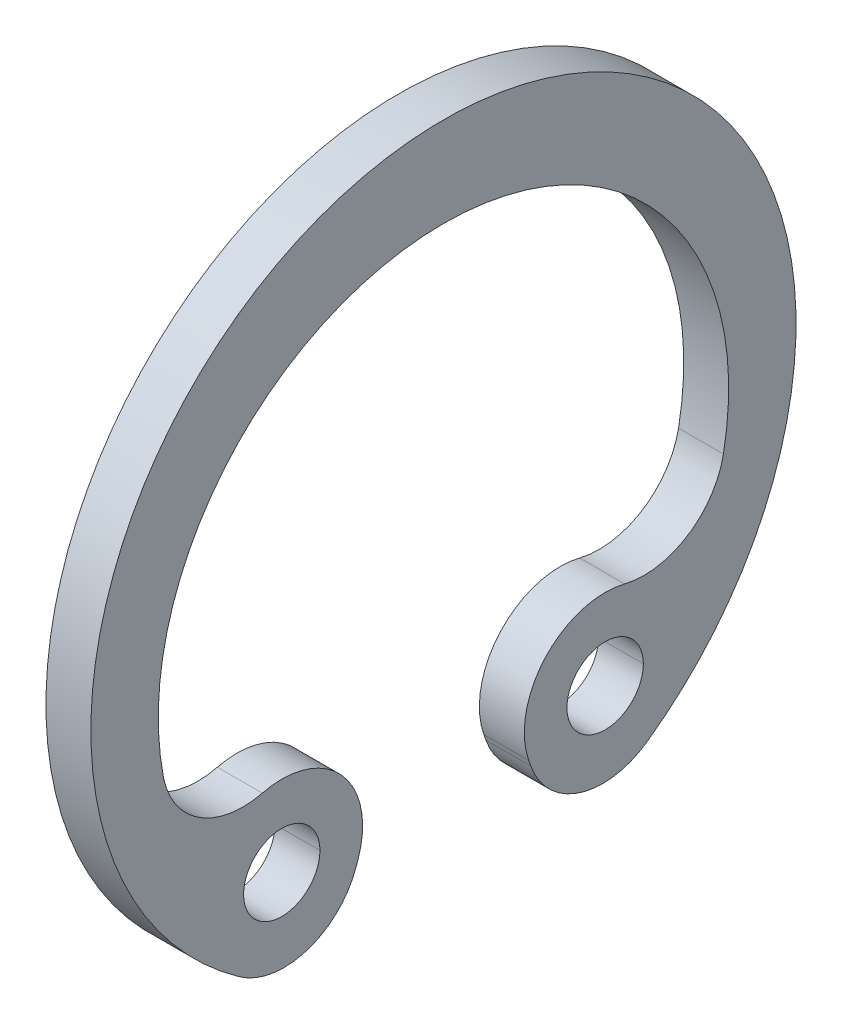
ISO-10303-21;
HEADER;
FILE_DESCRIPTION(('STEP AP214'),'2;1');
FILE_NAME('part.step','',(''),(''),'','','');
FILE_SCHEMA(('AUTOMOTIVE_DESIGN { 1 0 10303 214 1 1 1 1 }'));
ENDSEC;
DATA;
#1=APPLICATION_CONTEXT('core data for automotive mechanical design processes');
#2=APPLICATION_PROTOCOL_DEFINITION('international standard','automotive_design',2000,#1);
#3=PRODUCT_CONTEXT('',#1,'mechanical');
#4=PRODUCT('Part','Part','',(#3));
#5=PRODUCT_RELATED_PRODUCT_CATEGORY('part','',(#4));
#6=PRODUCT_DEFINITION_FORMATION('','',#4);
#7=PRODUCT_DEFINITION_CONTEXT('part definition',#1,'design');
#8=PRODUCT_DEFINITION('design','',#6,#7);
#9=PRODUCT_DEFINITION_SHAPE('','',#8);
#10=(LENGTH_UNIT() NAMED_UNIT(*) SI_UNIT(.MILLI.,.METRE.));
#11=(NAMED_UNIT(*) PLANE_ANGLE_UNIT() SI_UNIT($,.RADIAN.));
#12=(NAMED_UNIT(*) SI_UNIT($,.STERADIAN.) SOLID_ANGLE_UNIT());
#13=UNCERTAINTY_MEASURE_WITH_UNIT(LENGTH_MEASURE(1.E-05),#10,'distance_accuracy_value','');
#14=(GEOMETRIC_REPRESENTATION_CONTEXT(3) GLOBAL_UNCERTAINTY_ASSIGNED_CONTEXT((#13)) GLOBAL_UNIT_ASSIGNED_CONTEXT((#10,
#11,#12)) REPRESENTATION_CONTEXT('',''));
#15=CARTESIAN_POINT('',(0.,0.,0.));
#16=DIRECTION('',(0.,0.,1.));
#17=DIRECTION('',(1.,0.,0.));
#18=AXIS2_PLACEMENT_3D('',#15,#16,#17);
#19=CARTESIAN_POINT('',(0.5,-5.02211952987674,-3.54976272835661));
#20=DIRECTION('',(-1.,0.,0.));
#21=DIRECTION('',(0.,0.952290600530426,-0.30519274588594));
#22=AXIS2_PLACEMENT_3D('',#19,#20,#21);
#23=CYLINDRICAL_SURFACE('',#22,1.70000000000007);
#24=CARTESIAN_POINT('',(-0.5,-5.02211952987674,-3.54976272835661));
#25=DIRECTION('',(1.,0.,0.));
#26=DIRECTION('',(0.,0.,-1.));
#27=AXIS2_PLACEMENT_3D('',#24,#25,#26);
#28=CIRCLE('',#27,1.70000000000007);
#29=CARTESIAN_POINT('',(-0.5,-5.5813841739608,-1.9443895449884));
#30=VERTEX_POINT('',#29);
#31=CARTESIAN_POINT('',(-0.5,-6.4103476487508,-4.5309980161279));
#32=VERTEX_POINT('',#31);
#33=EDGE_CURVE('E11',#30,#32,#28,.T.);
#34=ORIENTED_EDGE('',*,*,#33,.T.);
#35=DIRECTION('',(-1.,0.,0.));
#36=VECTOR('',#35,1.);
#37=CARTESIAN_POINT('',(0.5,-6.4103476487508,-4.5309980161279));
#38=LINE('',#37,#36);
#39=CARTESIAN_POINT('',(0.5,-6.4103476487508,-4.5309980161279));
#40=VERTEX_POINT('',#39);
#41=EDGE_CURVE('E25',#40,#32,#38,.T.);
#42=ORIENTED_EDGE('',*,*,#41,.F.);
#43=CARTESIAN_POINT('',(0.5,-5.02211952987674,-3.54976272835661));
#44=DIRECTION('',(1.,0.,0.));
#45=DIRECTION('',(0.,0.,-1.));
#46=AXIS2_PLACEMENT_3D('',#43,#44,#45);
#47=CIRCLE('',#46,1.70000000000007);
#48=CARTESIAN_POINT('',(0.5,-5.5813841739608,-1.9443895449884));
#49=VERTEX_POINT('',#48);
#50=EDGE_CURVE('E301',#49,#40,#47,.T.);
#51=ORIENTED_EDGE('',*,*,#50,.F.);
#52=DIRECTION('',(-1.,0.,0.));
#53=VECTOR('',#52,1.);
#54=CARTESIAN_POINT('',(0.5,-5.5813841739608,-1.9443895449884));
#55=LINE('',#54,#53);
#56=EDGE_CURVE('E297',#49,#30,#55,.T.);
#57=ORIENTED_EDGE('',*,*,#56,.T.);
#58=EDGE_LOOP('',(#34,#42,#51,#57));
#59=FACE_BOUND('',#58,.T.);
#60=ADVANCED_FACE('F17',(#59),#23,.T.);
#61=CARTESIAN_POINT('',(0.5,-5.4545179606316,-1.9001930999631));
#62=DIRECTION('',(0.,0.328979202402276,-0.944337166687175));
#63=DIRECTION('',(0.,0.944337166687175,0.328979202402276));
#64=AXIS2_PLACEMENT_3D('',#61,#62,#63);
#65=PLANE('',#64);
#66=DIRECTION('',(0.,-0.944337166687175,-0.328979202402276));
#67=VECTOR('',#66,1.);
#68=CARTESIAN_POINT('',(-0.5,-5.4545179606316,-1.9001930999631));
#69=LINE('',#68,#67);
#70=CARTESIAN_POINT('',(-0.5,-5.4545179606316,-1.9001930999631));
#71=VERTEX_POINT('',#70);
#72=EDGE_CURVE('E292',#71,#30,#69,.T.);
#73=ORIENTED_EDGE('',*,*,#72,.T.);
#74=ORIENTED_EDGE('',*,*,#56,.F.);
#75=DIRECTION('',(0.,-0.944337166687175,-0.328979202402276));
#76=VECTOR('',#75,1.);
#77=CARTESIAN_POINT('',(0.5,-5.4545179606316,-1.9001930999631));
#78=LINE('',#77,#76);
#79=CARTESIAN_POINT('',(0.5,-5.4545179606316,-1.9001930999631));
#80=VERTEX_POINT('',#79);
#81=EDGE_CURVE('E287',#80,#49,#78,.T.);
#82=ORIENTED_EDGE('',*,*,#81,.F.);
#83=DIRECTION('',(-1.,0.,0.));
#84=VECTOR('',#83,1.);
#85=CARTESIAN_POINT('',(0.5,-5.4545179606316,-1.9001930999631));
#86=LINE('',#85,#84);
#87=EDGE_CURVE('E283',#80,#71,#86,.T.);
#88=ORIENTED_EDGE('',*,*,#87,.T.);
#89=EDGE_LOOP('',(#73,#74,#82,#88));
#90=FACE_BOUND('',#89,.T.);
#91=ADVANCED_FACE('F318',(#90),#65,.F.);
#92=CARTESIAN_POINT('',(0.5,-4.86235539630743,-3.6));
#93=DIRECTION('',(-1.,0.,0.));
#94=DIRECTION('',(0.,-0.673781281340793,-0.738930839060571));
#95=AXIS2_PLACEMENT_3D('',#92,#93,#94);
#96=CYLINDRICAL_SURFACE('',#95,1.8);
#97=CARTESIAN_POINT('',(-0.5,-4.86235539630743,-3.6));
#98=DIRECTION('',(1.,0.,0.));
#99=DIRECTION('',(0.,0.,-1.));
#100=AXIS2_PLACEMENT_3D('',#97,#98,#99);
#101=CIRCLE('',#100,1.8);
#102=CARTESIAN_POINT('',(-0.5,-3.1152620571958,-4.033203029112));
#103=VERTEX_POINT('',#102);
#104=EDGE_CURVE('E278',#103,#71,#101,.T.);
#105=ORIENTED_EDGE('',*,*,#104,.T.);
#106=ORIENTED_EDGE('',*,*,#87,.F.);
#107=CARTESIAN_POINT('',(0.5,-4.86235539630743,-3.6));
#108=DIRECTION('',(1.,0.,0.));
#109=DIRECTION('',(0.,0.,-1.));
#110=AXIS2_PLACEMENT_3D('',#107,#108,#109);
#111=CIRCLE('',#110,1.8);
#112=CARTESIAN_POINT('',(0.5,-3.1152620571958,-4.033203029112));
#113=VERTEX_POINT('',#112);
#114=EDGE_CURVE('E273',#113,#80,#111,.T.);
#115=ORIENTED_EDGE('',*,*,#114,.F.);
#116=DIRECTION('',(-1.,0.,0.));
#117=VECTOR('',#116,1.);
#118=CARTESIAN_POINT('',(0.5,-3.1152620571958,-4.033203029112));
#119=LINE('',#118,#117);
#120=EDGE_CURVE('E269',#113,#103,#119,.T.);
#121=ORIENTED_EDGE('',*,*,#120,.T.);
#122=EDGE_LOOP('',(#105,#106,#115,#121));
#123=FACE_BOUND('',#122,.T.);
#124=ADVANCED_FACE('F350',(#123),#96,.T.);
#125=CARTESIAN_POINT('',(0.5,-1.36816871808412,-4.46640605822394));
#126=DIRECTION('',(-1.,0.,0.));
#127=DIRECTION('',(0.,0.84304351995622,0.537845352736106));
#128=AXIS2_PLACEMENT_3D('',#125,#126,#127);
#129=CYLINDRICAL_SURFACE('',#128,1.80000000000005);
#130=CARTESIAN_POINT('',(-0.5,-1.36816871808412,-4.46640605822394));
#131=DIRECTION('',(1.,0.,0.));
#132=DIRECTION('',(0.,0.,-1.));
#133=AXIS2_PLACEMENT_3D('',#130,#131,#132);
#134=CIRCLE('',#133,1.80000000000005);
#135=CARTESIAN_POINT('',(-0.5,-1.71162007908451,-6.2333359274115));
#136=VERTEX_POINT('',#135);
#137=EDGE_CURVE('E264',#103,#136,#134,.T.);
#138=ORIENTED_EDGE('',*,*,#137,.F.);
#139=ORIENTED_EDGE('',*,*,#120,.F.);
#140=CARTESIAN_POINT('',(0.5,-1.36816871808412,-4.46640605822394));
#141=DIRECTION('',(1.,0.,0.));
#142=DIRECTION('',(0.,0.,-1.));
#143=AXIS2_PLACEMENT_3D('',#140,#141,#142);
#144=CIRCLE('',#143,1.80000000000005);
#145=CARTESIAN_POINT('',(0.5,-1.71162007908451,-6.2333359274115));
#146=VERTEX_POINT('',#145);
#147=EDGE_CURVE('E260',#113,#146,#144,.T.);
#148=ORIENTED_EDGE('',*,*,#147,.T.);
#149=DIRECTION('',(-1.,0.,0.));
#150=VECTOR('',#149,1.);
#151=CARTESIAN_POINT('',(0.5,-1.71162007908451,-6.2333359274115));
#152=LINE('',#151,#150);
#153=EDGE_CURVE('E256',#146,#136,#152,.T.);
#154=ORIENTED_EDGE('',*,*,#153,.T.);
#155=EDGE_LOOP('',(#138,#139,#148,#154));
#156=FACE_BOUND('',#155,.T.);
#157=ADVANCED_FACE('F347',(#156),#129,.F.);
#158=CARTESIAN_POINT('',(0.5,-0.499999999999989,0.));
#159=DIRECTION('',(-1.,0.,0.));
#160=DIRECTION('',(0.,-1.,3.31866429354254E-09));
#161=AXIS2_PLACEMENT_3D('',#158,#159,#160);
#162=CYLINDRICAL_SURFACE('',#161,6.35);
#163=CARTESIAN_POINT('',(-0.5,-0.499999999999989,0.));
#164=DIRECTION('',(1.,0.,0.));
#165=DIRECTION('',(0.,0.,-1.));
#166=AXIS2_PLACEMENT_3D('',#163,#164,#165);
#167=CIRCLE('',#166,6.35);
#168=CARTESIAN_POINT('',(-0.5,-1.711620037712,6.2333359354534));
#169=VERTEX_POINT('',#168);
#170=EDGE_CURVE('E251',#136,#169,#167,.T.);
#171=ORIENTED_EDGE('',*,*,#170,.F.);
#172=ORIENTED_EDGE('',*,*,#153,.F.);
#173=CARTESIAN_POINT('',(0.5,-0.499999999999989,0.));
#174=DIRECTION('',(1.,0.,0.));
#175=DIRECTION('',(0.,0.,-1.));
#176=AXIS2_PLACEMENT_3D('',#173,#174,#175);
#177=CIRCLE('',#176,6.35);
#178=CARTESIAN_POINT('',(0.5,-1.711620037712,6.2333359354534));
#179=VERTEX_POINT('',#178);
#180=EDGE_CURVE('E247',#146,#179,#177,.T.);
#181=ORIENTED_EDGE('',*,*,#180,.T.);
#182=DIRECTION('',(-1.,0.,0.));
#183=VECTOR('',#182,1.);
#184=CARTESIAN_POINT('',(0.5,-1.711620037712,6.2333359354534));
#185=LINE('',#184,#183);
#186=EDGE_CURVE('E243',#179,#169,#185,.T.);
#187=ORIENTED_EDGE('',*,*,#186,.T.);
#188=EDGE_LOOP('',(#171,#172,#181,#187));
#189=FACE_BOUND('',#188,.T.);
#190=ADVANCED_FACE('F344',(#189),#162,.F.);
#191=CARTESIAN_POINT('',(0.5,-1.36816871808408,4.46640605822394));
#192=DIRECTION('',(-1.,0.,0.));
#193=DIRECTION('',(0.,0.843043513659422,-0.537845362605996));
#194=AXIS2_PLACEMENT_3D('',#191,#192,#193);
#195=CYLINDRICAL_SURFACE('',#194,1.80000000000008);
#196=CARTESIAN_POINT('',(-0.5,-1.36816871808408,4.46640605822394));
#197=DIRECTION('',(1.,0.,0.));
#198=DIRECTION('',(0.,0.,-1.));
#199=AXIS2_PLACEMENT_3D('',#196,#197,#198);
#200=CIRCLE('',#199,1.80000000000008);
#201=CARTESIAN_POINT('',(-0.5,-3.1152620571958,4.033203029112));
#202=VERTEX_POINT('',#201);
#203=EDGE_CURVE('E238',#169,#202,#200,.T.);
#204=ORIENTED_EDGE('',*,*,#203,.F.);
#205=ORIENTED_EDGE('',*,*,#186,.F.);
#206=CARTESIAN_POINT('',(0.5,-1.36816871808408,4.46640605822394));
#207=DIRECTION('',(1.,0.,0.));
#208=DIRECTION('',(0.,0.,-1.));
#209=AXIS2_PLACEMENT_3D('',#206,#207,#208);
#210=CIRCLE('',#209,1.80000000000008);
#211=CARTESIAN_POINT('',(0.5,-3.1152620571958,4.033203029112));
#212=VERTEX_POINT('',#211);
#213=EDGE_CURVE('E234',#179,#212,#210,.T.);
#214=ORIENTED_EDGE('',*,*,#213,.T.);
#215=DIRECTION('',(-1.,0.,0.));
#216=VECTOR('',#215,1.);
#217=CARTESIAN_POINT('',(0.5,-3.1152620571958,4.033203029112));
#218=LINE('',#217,#216);
#219=EDGE_CURVE('E230',#212,#202,#218,.T.);
#220=ORIENTED_EDGE('',*,*,#219,.T.);
#221=EDGE_LOOP('',(#204,#205,#214,#220));
#222=FACE_BOUND('',#221,.T.);
#223=ADVANCED_FACE('F337',(#222),#195,.F.);
#224=CARTESIAN_POINT('',(0.5,-4.86235539630743,3.6));
#225=DIRECTION('',(-1.,0.,0.));
#226=DIRECTION('',(0.,-0.673781281340793,0.738930839060571));
#227=AXIS2_PLACEMENT_3D('',#224,#225,#226);
#228=CYLINDRICAL_SURFACE('',#227,1.8);
#229=CARTESIAN_POINT('',(-0.5,-4.86235539630743,3.6));
#230=DIRECTION('',(1.,0.,0.));
#231=DIRECTION('',(0.,0.,-1.));
#232=AXIS2_PLACEMENT_3D('',#229,#230,#231);
#233=CIRCLE('',#232,1.8);
#234=CARTESIAN_POINT('',(-0.5,-5.4545179606316,1.9001930999631));
#235=VERTEX_POINT('',#234);
#236=EDGE_CURVE('E225',#235,#202,#233,.T.);
#237=ORIENTED_EDGE('',*,*,#236,.T.);
#238=ORIENTED_EDGE('',*,*,#219,.F.);
#239=CARTESIAN_POINT('',(0.5,-4.86235539630743,3.6));
#240=DIRECTION('',(1.,0.,0.));
#241=DIRECTION('',(0.,0.,-1.));
#242=AXIS2_PLACEMENT_3D('',#239,#240,#241);
#243=CIRCLE('',#242,1.8);
#244=CARTESIAN_POINT('',(0.5,-5.4545179606316,1.9001930999631));
#245=VERTEX_POINT('',#244);
#246=EDGE_CURVE('E220',#245,#212,#243,.T.);
#247=ORIENTED_EDGE('',*,*,#246,.F.);
#248=DIRECTION('',(-1.,0.,0.));
#249=VECTOR('',#248,1.);
#250=CARTESIAN_POINT('',(0.5,-5.4545179606316,1.9001930999631));
#251=LINE('',#250,#249);
#252=EDGE_CURVE('E216',#245,#235,#251,.T.);
#253=ORIENTED_EDGE('',*,*,#252,.T.);
#254=EDGE_LOOP('',(#237,#238,#247,#253));
#255=FACE_BOUND('',#254,.T.);
#256=ADVANCED_FACE('F334',(#255),#228,.T.);
#257=CARTESIAN_POINT('',(0.5,-5.5813841739608,1.9443895449884));
#258=DIRECTION('',(0.,0.328979202402276,0.944337166687175));
#259=DIRECTION('',(0.,-0.944337166687175,0.328979202402276));
#260=AXIS2_PLACEMENT_3D('',#257,#258,#259);
#261=PLANE('',#260);
#262=DIRECTION('',(0.,0.944337166687175,-0.328979202402276));
#263=VECTOR('',#262,1.);
#264=CARTESIAN_POINT('',(-0.5,-5.5813841739608,1.9443895449884));
#265=LINE('',#264,#263);
#266=CARTESIAN_POINT('',(-0.5,-5.5813841739608,1.9443895449884));
#267=VERTEX_POINT('',#266);
#268=EDGE_CURVE('E211',#267,#235,#265,.T.);
#269=ORIENTED_EDGE('',*,*,#268,.T.);
#270=ORIENTED_EDGE('',*,*,#252,.F.);
#271=DIRECTION('',(0.,0.944337166687175,-0.328979202402276));
#272=VECTOR('',#271,1.);
#273=CARTESIAN_POINT('',(0.5,-5.5813841739608,1.9443895449884));
#274=LINE('',#273,#272);
#275=CARTESIAN_POINT('',(0.5,-5.5813841739608,1.9443895449884));
#276=VERTEX_POINT('',#275);
#277=EDGE_CURVE('E206',#276,#245,#274,.T.);
#278=ORIENTED_EDGE('',*,*,#277,.F.);
#279=DIRECTION('',(-1.,0.,0.));
#280=VECTOR('',#279,1.);
#281=CARTESIAN_POINT('',(0.5,-5.5813841739608,1.9443895449884));
#282=LINE('',#281,#280);
#283=EDGE_CURVE('E202',#276,#267,#282,.T.);
#284=ORIENTED_EDGE('',*,*,#283,.T.);
#285=EDGE_LOOP('',(#269,#270,#278,#284));
#286=FACE_BOUND('',#285,.T.);
#287=ADVANCED_FACE('F332',(#286),#261,.F.);
#288=CARTESIAN_POINT('',(0.5,-5.02211952987674,3.54976272835661));
#289=DIRECTION('',(-1.,0.,0.));
#290=DIRECTION('',(0.,0.952290593710149,0.305192767167199));
#291=AXIS2_PLACEMENT_3D('',#288,#289,#290);
#292=CYLINDRICAL_SURFACE('',#291,1.70000000000007);
#293=CARTESIAN_POINT('',(-0.5,-5.02211952987674,3.54976272835661));
#294=DIRECTION('',(1.,0.,0.));
#295=DIRECTION('',(0.,0.,-1.));
#296=AXIS2_PLACEMENT_3D('',#293,#294,#295);
#297=CIRCLE('',#296,1.70000000000007);
#298=CARTESIAN_POINT('',(-0.5,-6.410347692607,4.53099795408121));
#299=VERTEX_POINT('',#298);
#300=EDGE_CURVE('E197',#299,#267,#297,.T.);
#301=ORIENTED_EDGE('',*,*,#300,.T.);
#302=ORIENTED_EDGE('',*,*,#283,.F.);
#303=CARTESIAN_POINT('',(0.5,-5.02211952987674,3.54976272835661));
#304=DIRECTION('',(1.,0.,0.));
#305=DIRECTION('',(0.,0.,-1.));
#306=AXIS2_PLACEMENT_3D('',#303,#304,#305);
#307=CIRCLE('',#306,1.70000000000007);
#308=CARTESIAN_POINT('',(0.5,-6.410347692607,4.53099795408121));
#309=VERTEX_POINT('',#308);
#310=EDGE_CURVE('E192',#309,#276,#307,.T.);
#311=ORIENTED_EDGE('',*,*,#310,.F.);
#312=DIRECTION('',(-1.,0.,0.));
#313=VECTOR('',#312,1.);
#314=CARTESIAN_POINT('',(0.5,-6.410347692607,4.53099795408121));
#315=LINE('',#314,#313);
#316=EDGE_CURVE('E188',#309,#299,#315,.T.);
#317=ORIENTED_EDGE('',*,*,#316,.T.);
#318=EDGE_LOOP('',(#301,#302,#311,#317));
#319=FACE_BOUND('',#318,.T.);
#320=ADVANCED_FACE('F327',(#319),#292,.T.);
#321=CARTESIAN_POINT('',(0.5,0.,0.));
#322=DIRECTION('',(-1.,0.,0.));
#323=DIRECTION('',(0.,-1.,-4.83955625002121E-09));
#324=AXIS2_PLACEMENT_3D('',#321,#322,#323);
#325=CYLINDRICAL_SURFACE('',#324,7.85);
#326=CARTESIAN_POINT('',(-0.5,0.,0.));
#327=DIRECTION('',(1.,0.,0.));
#328=DIRECTION('',(0.,0.,-1.));
#329=AXIS2_PLACEMENT_3D('',#326,#327,#328);
#330=CIRCLE('',#329,7.85);
#331=EDGE_CURVE('E183',#32,#299,#330,.T.);
#332=ORIENTED_EDGE('',*,*,#331,.T.);
#333=ORIENTED_EDGE('',*,*,#316,.F.);
#334=CARTESIAN_POINT('',(0.5,0.,0.));
#335=DIRECTION('',(1.,0.,0.));
#336=DIRECTION('',(0.,0.,-1.));
#337=AXIS2_PLACEMENT_3D('',#334,#335,#336);
#338=CIRCLE('',#337,7.85);
#339=EDGE_CURVE('E178',#40,#309,#338,.T.);
#340=ORIENTED_EDGE('',*,*,#339,.F.);
#341=ORIENTED_EDGE('',*,*,#41,.T.);
#342=EDGE_LOOP('',(#332,#333,#340,#341));
#343=FACE_BOUND('',#342,.T.);
#344=ADVANCED_FACE('F311',(#343),#325,.T.);
#345=CARTESIAN_POINT('',(0.5,-5.02211952987674,-3.54976272835661));
#346=DIRECTION('',(1.,0.,0.));
#347=DIRECTION('',(0.,0.,-1.));
#348=AXIS2_PLACEMENT_3D('',#345,#346,#347);
#349=PLANE('',#348);
#350=CARTESIAN_POINT('',(0.5,-4.8623553963074,3.6));
#351=DIRECTION('',(1.,0.,0.));
#352=DIRECTION('',(0.,0.,-1.));
#353=AXIS2_PLACEMENT_3D('',#350,#351,#352);
#354=CIRCLE('',#353,0.85);
#355=CARTESIAN_POINT('',(0.5,-4.8623553963074,4.45));
#356=VERTEX_POINT('',#355);
#357=CARTESIAN_POINT('',(0.5,-4.8623553963074,2.75));
#358=VERTEX_POINT('',#357);
#359=EDGE_CURVE('E134',#356,#358,#354,.T.);
#360=ORIENTED_EDGE('',*,*,#359,.F.);
#361=CARTESIAN_POINT('',(0.5,-4.8623553963074,3.6));
#362=DIRECTION('',(1.,0.,0.));
#363=DIRECTION('',(0.,0.,-1.));
#364=AXIS2_PLACEMENT_3D('',#361,#362,#363);
#365=CIRCLE('',#364,0.85);
#366=EDGE_CURVE('E171',#358,#356,#365,.T.);
#367=ORIENTED_EDGE('',*,*,#366,.F.);
#368=EDGE_LOOP('',(#360,#367));
#369=FACE_BOUND('',#368,.T.);
#370=CARTESIAN_POINT('',(0.5,-4.8623553963074,-3.6));
#371=DIRECTION('',(1.,0.,0.));
#372=DIRECTION('',(0.,0.,-1.));
#373=AXIS2_PLACEMENT_3D('',#370,#371,#372);
#374=CIRCLE('',#373,0.85);
#375=CARTESIAN_POINT('',(0.5,-4.8623553963074,-2.75));
#376=VERTEX_POINT('',#375);
#377=CARTESIAN_POINT('',(0.5,-4.8623553963074,-4.45));
#378=VERTEX_POINT('',#377);
#379=EDGE_CURVE('E166',#376,#378,#374,.T.);
#380=ORIENTED_EDGE('',*,*,#379,.F.);
#381=CARTESIAN_POINT('',(0.5,-4.8623553963074,-3.6));
#382=DIRECTION('',(1.,0.,0.));
#383=DIRECTION('',(0.,0.,-1.));
#384=AXIS2_PLACEMENT_3D('',#381,#382,#383);
#385=CIRCLE('',#384,0.85);
#386=EDGE_CURVE('E161',#378,#376,#385,.T.);
#387=ORIENTED_EDGE('',*,*,#386,.F.);
#388=EDGE_LOOP('',(#380,#387));
#389=FACE_BOUND('',#388,.T.);
#390=ORIENTED_EDGE('',*,*,#50,.T.);
#391=ORIENTED_EDGE('',*,*,#339,.T.);
#392=ORIENTED_EDGE('',*,*,#310,.T.);
#393=ORIENTED_EDGE('',*,*,#277,.T.);
#394=ORIENTED_EDGE('',*,*,#246,.T.);
#395=ORIENTED_EDGE('',*,*,#213,.F.);
#396=ORIENTED_EDGE('',*,*,#180,.F.);
#397=ORIENTED_EDGE('',*,*,#147,.F.);
#398=ORIENTED_EDGE('',*,*,#114,.T.);
#399=ORIENTED_EDGE('',*,*,#81,.T.);
#400=EDGE_LOOP('',(#390,#391,#392,#393,#394,#395,#396,#397,#398,#399));
#401=FACE_BOUND('',#400,.T.);
#402=ADVANCED_FACE('F315',(#369,#389,#401),#349,.T.);
#403=CARTESIAN_POINT('',(0.5,-4.8623553963074,-3.6));
#404=DIRECTION('',(-1.,0.,0.));
#405=DIRECTION('',(0.,-1.,0.));
#406=AXIS2_PLACEMENT_3D('',#403,#404,#405);
#407=CYLINDRICAL_SURFACE('',#406,0.85);
#408=DIRECTION('',(-1.,0.,0.));
#409=VECTOR('',#408,1.);
#410=CARTESIAN_POINT('',(0.5,-4.8623553963074,-4.45));
#411=LINE('',#410,#409);
#412=CARTESIAN_POINT('',(-0.5,-4.8623553963074,-4.45));
#413=VERTEX_POINT('',#412);
#414=EDGE_CURVE('E156',#378,#413,#411,.T.);
#415=ORIENTED_EDGE('',*,*,#414,.F.);
#416=ORIENTED_EDGE('',*,*,#386,.T.);
#417=DIRECTION('',(-1.,0.,0.));
#418=VECTOR('',#417,1.);
#419=CARTESIAN_POINT('',(0.5,-4.8623553963074,-2.75));
#420=LINE('',#419,#418);
#421=CARTESIAN_POINT('',(-0.5,-4.8623553963074,-2.75));
#422=VERTEX_POINT('',#421);
#423=EDGE_CURVE('E152',#376,#422,#420,.T.);
#424=ORIENTED_EDGE('',*,*,#423,.T.);
#425=CARTESIAN_POINT('',(-0.5,-4.8623553963074,-3.6));
#426=DIRECTION('',(1.,0.,0.));
#427=DIRECTION('',(0.,0.,-1.));
#428=AXIS2_PLACEMENT_3D('',#425,#426,#427);
#429=CIRCLE('',#428,0.85);
#430=EDGE_CURVE('E131',#413,#422,#429,.T.);
#431=ORIENTED_EDGE('',*,*,#430,.F.);
#432=EDGE_LOOP('',(#415,#416,#424,#431));
#433=FACE_BOUND('',#432,.T.);
#434=ADVANCED_FACE('F447',(#433),#407,.F.);
#435=CARTESIAN_POINT('',(-0.5,-5.02211952987674,-3.54976272835661));
#436=DIRECTION('',(1.,0.,0.));
#437=DIRECTION('',(0.,0.,-1.));
#438=AXIS2_PLACEMENT_3D('',#435,#436,#437);
#439=PLANE('',#438);
#440=CARTESIAN_POINT('',(-0.5,-4.8623553963074,3.6));
#441=DIRECTION('',(1.,0.,0.));
#442=DIRECTION('',(0.,0.,-1.));
#443=AXIS2_PLACEMENT_3D('',#440,#441,#442);
#444=CIRCLE('',#443,0.85);
#445=CARTESIAN_POINT('',(-0.5,-4.8623553963074,2.75));
#446=VERTEX_POINT('',#445);
#447=CARTESIAN_POINT('',(-0.5,-4.8623553963074,4.45));
#448=VERTEX_POINT('',#447);
#449=EDGE_CURVE('E117',#446,#448,#444,.T.);
#450=ORIENTED_EDGE('',*,*,#449,.T.);
#451=CARTESIAN_POINT('',(-0.5,-4.8623553963074,3.6));
#452=DIRECTION('',(1.,0.,0.));
#453=DIRECTION('',(0.,0.,-1.));
#454=AXIS2_PLACEMENT_3D('',#451,#452,#453);
#455=CIRCLE('',#454,0.85);
#456=EDGE_CURVE('E113',#448,#446,#455,.T.);
#457=ORIENTED_EDGE('',*,*,#456,.T.);
#458=EDGE_LOOP('',(#450,#457));
#459=FACE_BOUND('',#458,.T.);
#460=ORIENTED_EDGE('',*,*,#430,.T.);
#461=CARTESIAN_POINT('',(-0.5,-4.8623553963074,-3.6));
#462=DIRECTION('',(1.,0.,0.));
#463=DIRECTION('',(0.,0.,-1.));
#464=AXIS2_PLACEMENT_3D('',#461,#462,#463);
#465=CIRCLE('',#464,0.85);
#466=EDGE_CURVE('E122',#422,#413,#465,.T.);
#467=ORIENTED_EDGE('',*,*,#466,.T.);
#468=EDGE_LOOP('',(#460,#467));
#469=FACE_BOUND('',#468,.T.);
#470=ORIENTED_EDGE('',*,*,#33,.F.);
#471=ORIENTED_EDGE('',*,*,#72,.F.);
#472=ORIENTED_EDGE('',*,*,#104,.F.);
#473=ORIENTED_EDGE('',*,*,#137,.T.);
#474=ORIENTED_EDGE('',*,*,#170,.T.);
#475=ORIENTED_EDGE('',*,*,#203,.T.);
#476=ORIENTED_EDGE('',*,*,#236,.F.);
#477=ORIENTED_EDGE('',*,*,#268,.F.);
#478=ORIENTED_EDGE('',*,*,#300,.F.);
#479=ORIENTED_EDGE('',*,*,#331,.F.);
#480=EDGE_LOOP('',(#470,#471,#472,#473,#474,#475,#476,#477,#478,#479));
#481=FACE_BOUND('',#480,.T.);
#482=ADVANCED_FACE('F115',(#459,#469,#481),#439,.F.);
#483=CARTESIAN_POINT('',(0.5,-4.8623553963074,-3.6));
#484=DIRECTION('',(-1.,0.,0.));
#485=DIRECTION('',(0.,1.,0.));
#486=AXIS2_PLACEMENT_3D('',#483,#484,#485);
#487=CYLINDRICAL_SURFACE('',#486,0.85);
#488=ORIENTED_EDGE('',*,*,#414,.T.);
#489=ORIENTED_EDGE('',*,*,#466,.F.);
#490=ORIENTED_EDGE('',*,*,#423,.F.);
#491=ORIENTED_EDGE('',*,*,#379,.T.);
#492=EDGE_LOOP('',(#488,#489,#490,#491));
#493=FACE_BOUND('',#492,.T.);
#494=ADVANCED_FACE('F468',(#493),#487,.F.);
#495=CARTESIAN_POINT('',(0.5,-4.8623553963074,3.6));
#496=DIRECTION('',(-1.,0.,0.));
#497=DIRECTION('',(0.,1.,0.));
#498=AXIS2_PLACEMENT_3D('',#495,#496,#497);
#499=CYLINDRICAL_SURFACE('',#498,0.85);
#500=DIRECTION('',(-1.,0.,0.));
#501=VECTOR('',#500,1.);
#502=CARTESIAN_POINT('',(0.5,-4.8623553963074,2.75));
#503=LINE('',#502,#501);
#504=EDGE_CURVE('E128',#358,#446,#503,.T.);
#505=ORIENTED_EDGE('',*,*,#504,.T.);
#506=ORIENTED_EDGE('',*,*,#456,.F.);
#507=DIRECTION('',(-1.,0.,0.));
#508=VECTOR('',#507,1.);
#509=CARTESIAN_POINT('',(0.5,-4.8623553963074,4.45));
#510=LINE('',#509,#508);
#511=EDGE_CURVE('E130',#356,#448,#510,.T.);
#512=ORIENTED_EDGE('',*,*,#511,.F.);
#513=ORIENTED_EDGE('',*,*,#359,.T.);
#514=EDGE_LOOP('',(#505,#506,#512,#513));
#515=FACE_BOUND('',#514,.T.);
#516=ADVANCED_FACE('F133',(#515),#499,.F.);
#517=CARTESIAN_POINT('',(0.5,-4.8623553963074,3.6));
#518=DIRECTION('',(-1.,0.,0.));
#519=DIRECTION('',(0.,-1.,0.));
#520=AXIS2_PLACEMENT_3D('',#517,#518,#519);
#521=CYLINDRICAL_SURFACE('',#520,0.85);
#522=ORIENTED_EDGE('',*,*,#504,.F.);
#523=ORIENTED_EDGE('',*,*,#366,.T.);
#524=ORIENTED_EDGE('',*,*,#511,.T.);
#525=ORIENTED_EDGE('',*,*,#449,.F.);
#526=EDGE_LOOP('',(#522,#523,#524,#525));
#527=FACE_BOUND('',#526,.T.);
#528=ADVANCED_FACE('F126',(#527),#521,.F.);
#529=CLOSED_SHELL('',(#60,#91,#124,#157,#190,#223,#256,#287,#320,#344,#402,#434,#482,#494,#516,#528));
#530=MANIFOLD_SOLID_BREP('B1',#529);
#531=ADVANCED_BREP_SHAPE_REPRESENTATION('',(#18,#530),#14);
#532=SHAPE_DEFINITION_REPRESENTATION(#9,#531);
ENDSEC;
END-ISO-10303-21;
